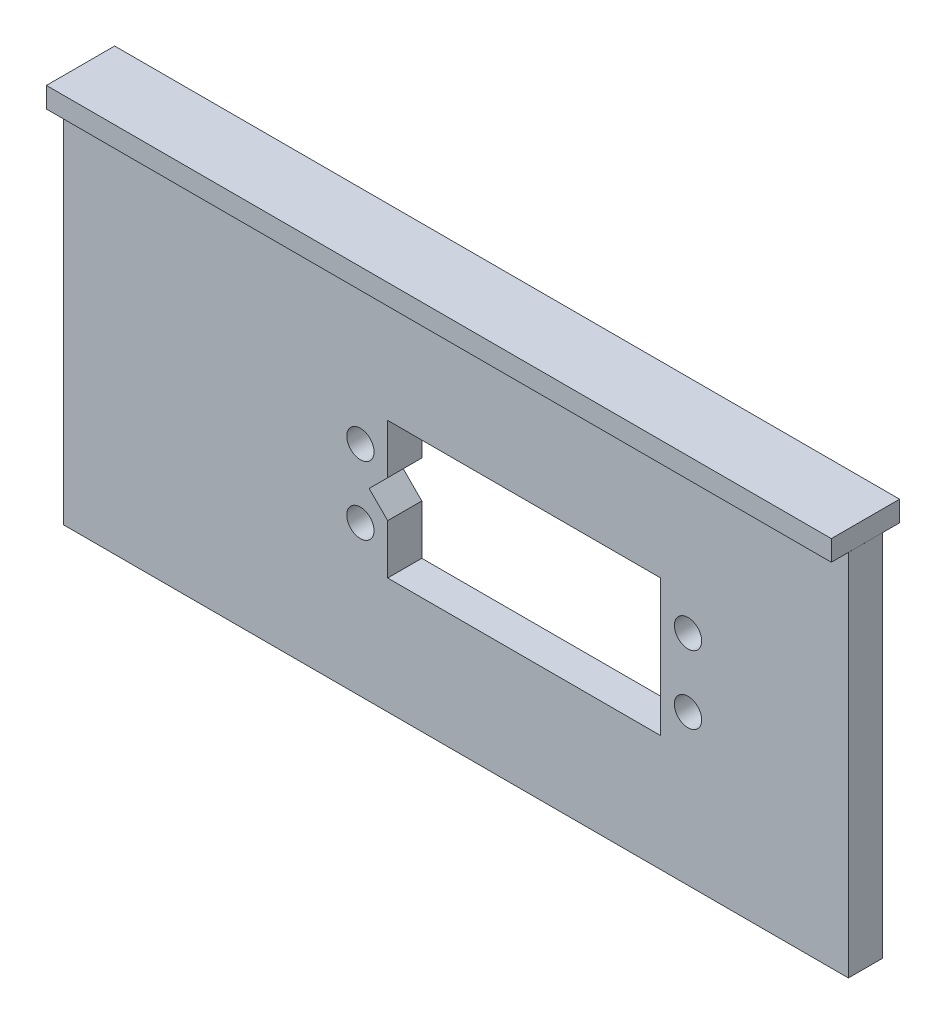
ISO-10303-21;
HEADER;
FILE_DESCRIPTION(('STEP AP214'),'2;1');
FILE_NAME('part.step','',(''),(''),'','','');
FILE_SCHEMA(('AUTOMOTIVE_DESIGN { 1 0 10303 214 1 1 1 1 }'));
ENDSEC;
DATA;
#1=APPLICATION_CONTEXT('core data for automotive mechanical design processes');
#2=APPLICATION_PROTOCOL_DEFINITION('international standard','automotive_design',2000,#1);
#3=PRODUCT_CONTEXT('',#1,'mechanical');
#4=PRODUCT('Part','Part','',(#3));
#5=PRODUCT_RELATED_PRODUCT_CATEGORY('part','',(#4));
#6=PRODUCT_DEFINITION_FORMATION('','',#4);
#7=PRODUCT_DEFINITION_CONTEXT('part definition',#1,'design');
#8=PRODUCT_DEFINITION('design','',#6,#7);
#9=PRODUCT_DEFINITION_SHAPE('','',#8);
#10=(LENGTH_UNIT() NAMED_UNIT(*) SI_UNIT(.MILLI.,.METRE.));
#11=(NAMED_UNIT(*) PLANE_ANGLE_UNIT() SI_UNIT($,.RADIAN.));
#12=(NAMED_UNIT(*) SI_UNIT($,.STERADIAN.) SOLID_ANGLE_UNIT());
#13=UNCERTAINTY_MEASURE_WITH_UNIT(LENGTH_MEASURE(1.E-05),#10,'distance_accuracy_value','');
#14=(GEOMETRIC_REPRESENTATION_CONTEXT(3) GLOBAL_UNCERTAINTY_ASSIGNED_CONTEXT((#13)) GLOBAL_UNIT_ASSIGNED_CONTEXT((#10,
#11,#12)) REPRESENTATION_CONTEXT('',''));
#15=CARTESIAN_POINT('',(0.,0.,0.));
#16=DIRECTION('',(0.,0.,1.));
#17=DIRECTION('',(1.,0.,0.));
#18=AXIS2_PLACEMENT_3D('',#15,#16,#17);
#19=CARTESIAN_POINT('',(3.06248058403234,6.51590056603846,5.));
#20=DIRECTION('',(1.,0.,0.));
#21=DIRECTION('',(0.,0.,-1.));
#22=AXIS2_PLACEMENT_3D('',#19,#20,#21);
#23=PLANE('',#22);
#24=DIRECTION('',(0.,0.,1.));
#25=VECTOR('',#24,1.);
#26=CARTESIAN_POINT('',(3.06248058403234,-0.762325883736207,5.));
#27=LINE('',#26,#25);
#28=CARTESIAN_POINT('',(3.06248058403234,-0.762325883736207,0.));
#29=VERTEX_POINT('',#28);
#30=CARTESIAN_POINT('',(3.06248058403234,-0.762325883736207,5.));
#31=VERTEX_POINT('',#30);
#32=EDGE_CURVE('E121',#29,#31,#27,.T.);
#33=ORIENTED_EDGE('',*,*,#32,.F.);
#34=DIRECTION('',(0.,-1.,0.));
#35=VECTOR('',#34,1.);
#36=CARTESIAN_POINT('',(3.06248058403234,6.51590056603846,0.));
#37=LINE('',#36,#35);
#38=CARTESIAN_POINT('',(3.06248058403234,6.51590056603846,0.));
#39=VERTEX_POINT('',#38);
#40=EDGE_CURVE('E306',#39,#29,#37,.T.);
#41=ORIENTED_EDGE('',*,*,#40,.F.);
#42=DIRECTION('',(0.,0.,-1.));
#43=VECTOR('',#42,1.);
#44=CARTESIAN_POINT('',(3.06248058403234,6.51590056603846,5.));
#45=LINE('',#44,#43);
#46=CARTESIAN_POINT('',(3.06248058403234,6.51590056603846,5.));
#47=VERTEX_POINT('',#46);
#48=EDGE_CURVE('E305',#47,#39,#45,.T.);
#49=ORIENTED_EDGE('',*,*,#48,.F.);
#50=DIRECTION('',(0.,-1.,0.));
#51=VECTOR('',#50,1.);
#52=CARTESIAN_POINT('',(3.06248058403234,6.51590056603846,5.));
#53=LINE('',#52,#51);
#54=EDGE_CURVE('E293',#47,#31,#53,.T.);
#55=ORIENTED_EDGE('',*,*,#54,.T.);
#56=EDGE_LOOP('',(#33,#41,#49,#55));
#57=FACE_BOUND('',#56,.T.);
#58=ADVANCED_FACE('F117',(#57),#23,.T.);
#59=CARTESIAN_POINT('',(0.,0.,5.));
#60=DIRECTION('',(0.,0.,1.));
#61=DIRECTION('',(1.,0.,0.));
#62=AXIS2_PLACEMENT_3D('',#59,#60,#61);
#63=PLANE('',#62);
#64=DIRECTION('',(-0.707106781186539,-0.707106781186556,0.));
#65=VECTOR('',#64,1.);
#66=CARTESIAN_POINT('',(3.06248058403234,-0.762325883736207,5.));
#67=LINE('',#66,#65);
#68=CARTESIAN_POINT('',(0.340707033807064,-3.48409943396155,5.));
#69=VERTEX_POINT('',#68);
#70=EDGE_CURVE('E257',#31,#69,#67,.T.);
#71=ORIENTED_EDGE('',*,*,#70,.F.);
#72=ORIENTED_EDGE('',*,*,#54,.F.);
#73=DIRECTION('',(1.,0.,0.));
#74=VECTOR('',#73,1.);
#75=CARTESIAN_POINT('',(3.06248058403234,6.51590056603846,5.));
#76=LINE('',#75,#74);
#77=CARTESIAN_POINT('',(43.0624805840323,6.51590056603846,5.));
#78=VERTEX_POINT('',#77);
#79=EDGE_CURVE('E302',#47,#78,#76,.T.);
#80=ORIENTED_EDGE('',*,*,#79,.T.);
#81=DIRECTION('',(0.,-1.,0.));
#82=VECTOR('',#81,1.);
#83=CARTESIAN_POINT('',(43.0624805840323,6.51590056603846,5.));
#84=LINE('',#83,#82);
#85=CARTESIAN_POINT('',(43.0624805840323,-13.4840994339615,5.));
#86=VERTEX_POINT('',#85);
#87=EDGE_CURVE('E299',#78,#86,#84,.T.);
#88=ORIENTED_EDGE('',*,*,#87,.T.);
#89=DIRECTION('',(1.,0.,0.));
#90=VECTOR('',#89,1.);
#91=CARTESIAN_POINT('',(3.06248058403234,-13.4840994339615,5.));
#92=LINE('',#91,#90);
#93=CARTESIAN_POINT('',(3.06248058403234,-13.4840994339615,5.));
#94=VERTEX_POINT('',#93);
#95=EDGE_CURVE('E296',#94,#86,#92,.T.);
#96=ORIENTED_EDGE('',*,*,#95,.F.);
#97=CARTESIAN_POINT('',(3.06248058403234,-6.20587298418675,5.));
#98=VERTEX_POINT('',#97);
#99=EDGE_CURVE('E297',#98,#94,#53,.T.);
#100=ORIENTED_EDGE('',*,*,#99,.F.);
#101=DIRECTION('',(0.707106781186556,-0.707106781186539,0.));
#102=VECTOR('',#101,1.);
#103=CARTESIAN_POINT('',(0.340707033807064,-3.48409943396155,5.));
#104=LINE('',#103,#102);
#105=EDGE_CURVE('E141',#69,#98,#104,.T.);
#106=ORIENTED_EDGE('',*,*,#105,.F.);
#107=EDGE_LOOP('',(#71,#72,#80,#88,#96,#100,#106));
#108=FACE_BOUND('',#107,.T.);
#109=CARTESIAN_POINT('',(-0.937519415967665,-8.48409943396155,5.));
#110=DIRECTION('',(0.,0.,1.));
#111=DIRECTION('',(1.,0.,0.));
#112=AXIS2_PLACEMENT_3D('',#109,#110,#111);
#113=CIRCLE('',#112,2.);
#114=CARTESIAN_POINT('',(1.06248058403234,-8.48409943396155,5.));
#115=VERTEX_POINT('',#114);
#116=EDGE_CURVE('E328',#115,#115,#113,.T.);
#117=ORIENTED_EDGE('',*,*,#116,.F.);
#118=EDGE_LOOP('',(#117));
#119=FACE_BOUND('',#118,.T.);
#120=CARTESIAN_POINT('',(-0.937519415967661,1.51590056603845,5.));
#121=DIRECTION('',(0.,0.,1.));
#122=DIRECTION('',(1.,0.,0.));
#123=AXIS2_PLACEMENT_3D('',#120,#121,#122);
#124=CIRCLE('',#123,2.);
#125=CARTESIAN_POINT('',(1.06248058403234,1.51590056603845,5.));
#126=VERTEX_POINT('',#125);
#127=EDGE_CURVE('E340',#126,#126,#124,.T.);
#128=ORIENTED_EDGE('',*,*,#127,.F.);
#129=EDGE_LOOP('',(#128));
#130=FACE_BOUND('',#129,.T.);
#131=DIRECTION('',(0.,-1.,0.));
#132=VECTOR('',#131,1.);
#133=CARTESIAN_POINT('',(-44.4375194159677,23.5159005660385,5.));
#134=LINE('',#133,#132);
#135=CARTESIAN_POINT('',(-44.4375194159677,23.5159005660385,5.));
#136=VERTEX_POINT('',#135);
#137=CARTESIAN_POINT('',(-44.4375194159677,-30.4840994339615,5.));
#138=VERTEX_POINT('',#137);
#139=EDGE_CURVE('E346',#136,#138,#134,.T.);
#140=ORIENTED_EDGE('',*,*,#139,.T.);
#141=DIRECTION('',(1.,0.,0.));
#142=VECTOR('',#141,1.);
#143=CARTESIAN_POINT('',(-44.4375194159677,-30.4840994339615,5.));
#144=LINE('',#143,#142);
#145=CARTESIAN_POINT('',(70.5624805840323,-30.4840994339615,5.));
#146=VERTEX_POINT('',#145);
#147=EDGE_CURVE('E349',#138,#146,#144,.T.);
#148=ORIENTED_EDGE('',*,*,#147,.T.);
#149=DIRECTION('',(0.,-1.,0.));
#150=VECTOR('',#149,1.);
#151=CARTESIAN_POINT('',(70.5624805840323,23.5159005660385,5.));
#152=LINE('',#151,#150);
#153=CARTESIAN_POINT('',(70.5624805840323,23.5159005660385,5.));
#154=VERTEX_POINT('',#153);
#155=EDGE_CURVE('E352',#154,#146,#152,.T.);
#156=ORIENTED_EDGE('',*,*,#155,.F.);
#157=DIRECTION('',(1.,0.,0.));
#158=VECTOR('',#157,1.);
#159=CARTESIAN_POINT('',(-44.4375194159677,23.5159005660385,5.));
#160=LINE('',#159,#158);
#161=CARTESIAN_POINT('',(70.5602786354649,23.5159005660385,5.));
#162=VERTEX_POINT('',#161);
#163=EDGE_CURVE('E355',#162,#154,#160,.T.);
#164=ORIENTED_EDGE('',*,*,#163,.F.);
#165=EDGE_CURVE('E356',#136,#162,#160,.T.);
#166=ORIENTED_EDGE('',*,*,#165,.F.);
#167=EDGE_LOOP('',(#140,#148,#156,#164,#166));
#168=FACE_BOUND('',#167,.T.);
#169=CARTESIAN_POINT('',(47.0624805840323,-8.48409943396155,5.));
#170=DIRECTION('',(0.,0.,1.));
#171=DIRECTION('',(1.,0.,0.));
#172=AXIS2_PLACEMENT_3D('',#169,#170,#171);
#173=CIRCLE('',#172,2.);
#174=CARTESIAN_POINT('',(49.0624805840323,-8.48409943396155,5.));
#175=VERTEX_POINT('',#174);
#176=EDGE_CURVE('E334',#175,#175,#173,.T.);
#177=ORIENTED_EDGE('',*,*,#176,.F.);
#178=EDGE_LOOP('',(#177));
#179=FACE_BOUND('',#178,.T.);
#180=CARTESIAN_POINT('',(47.0624805840323,1.51590056603845,5.));
#181=DIRECTION('',(0.,0.,1.));
#182=DIRECTION('',(1.,0.,0.));
#183=AXIS2_PLACEMENT_3D('',#180,#181,#182);
#184=CIRCLE('',#183,2.);
#185=CARTESIAN_POINT('',(49.0624805840323,1.51590056603845,5.));
#186=VERTEX_POINT('',#185);
#187=EDGE_CURVE('E287',#186,#186,#184,.T.);
#188=ORIENTED_EDGE('',*,*,#187,.F.);
#189=EDGE_LOOP('',(#188));
#190=FACE_BOUND('',#189,.T.);
#191=ADVANCED_FACE('F384',(#108,#119,#130,#168,#179,#190),#63,.T.);
#192=CARTESIAN_POINT('',(0.,0.,0.));
#193=DIRECTION('',(0.,0.,1.));
#194=DIRECTION('',(1.,0.,0.));
#195=AXIS2_PLACEMENT_3D('',#192,#193,#194);
#196=PLANE('',#195);
#197=CARTESIAN_POINT('',(-0.937519415967665,-8.48409943396155,0.));
#198=DIRECTION('',(0.,0.,1.));
#199=DIRECTION('',(1.,0.,0.));
#200=AXIS2_PLACEMENT_3D('',#197,#198,#199);
#201=CIRCLE('',#200,2.);
#202=CARTESIAN_POINT('',(1.06248058403234,-8.48409943396155,0.));
#203=VERTEX_POINT('',#202);
#204=EDGE_CURVE('E327',#203,#203,#201,.T.);
#205=ORIENTED_EDGE('',*,*,#204,.T.);
#206=EDGE_LOOP('',(#205));
#207=FACE_BOUND('',#206,.T.);
#208=CARTESIAN_POINT('',(47.0624805840323,-8.48409943396155,0.));
#209=DIRECTION('',(0.,0.,1.));
#210=DIRECTION('',(1.,0.,0.));
#211=AXIS2_PLACEMENT_3D('',#208,#209,#210);
#212=CIRCLE('',#211,2.);
#213=CARTESIAN_POINT('',(49.0624805840323,-8.48409943396155,0.));
#214=VERTEX_POINT('',#213);
#215=EDGE_CURVE('E331',#214,#214,#212,.T.);
#216=ORIENTED_EDGE('',*,*,#215,.T.);
#217=EDGE_LOOP('',(#216));
#218=FACE_BOUND('',#217,.T.);
#219=CARTESIAN_POINT('',(-0.937519415967661,1.51590056603845,0.));
#220=DIRECTION('',(0.,0.,1.));
#221=DIRECTION('',(1.,0.,0.));
#222=AXIS2_PLACEMENT_3D('',#219,#220,#221);
#223=CIRCLE('',#222,2.);
#224=CARTESIAN_POINT('',(1.06248058403234,1.51590056603845,0.));
#225=VERTEX_POINT('',#224);
#226=EDGE_CURVE('E337',#225,#225,#223,.T.);
#227=ORIENTED_EDGE('',*,*,#226,.T.);
#228=EDGE_LOOP('',(#227));
#229=FACE_BOUND('',#228,.T.);
#230=DIRECTION('',(0.,-1.,0.));
#231=VECTOR('',#230,1.);
#232=CARTESIAN_POINT('',(-44.4375194159677,23.5159005660385,0.));
#233=LINE('',#232,#231);
#234=CARTESIAN_POINT('',(-44.4375194159677,23.5159005660385,0.));
#235=VERTEX_POINT('',#234);
#236=CARTESIAN_POINT('',(-44.4375194159677,-30.4840994339615,0.));
#237=VERTEX_POINT('',#236);
#238=EDGE_CURVE('E343',#235,#237,#233,.T.);
#239=ORIENTED_EDGE('',*,*,#238,.F.);
#240=DIRECTION('',(1.,0.,0.));
#241=VECTOR('',#240,1.);
#242=CARTESIAN_POINT('',(-44.4375194159677,23.5159005660385,0.));
#243=LINE('',#242,#241);
#244=CARTESIAN_POINT('',(70.5602786354649,23.5159005660385,0.));
#245=VERTEX_POINT('',#244);
#246=EDGE_CURVE('E350',#235,#245,#243,.T.);
#247=ORIENTED_EDGE('',*,*,#246,.T.);
#248=CARTESIAN_POINT('',(70.5624805840323,23.5159005660385,0.));
#249=VERTEX_POINT('',#248);
#250=EDGE_CURVE('E367',#245,#249,#243,.T.);
#251=ORIENTED_EDGE('',*,*,#250,.T.);
#252=DIRECTION('',(0.,-1.,0.));
#253=VECTOR('',#252,1.);
#254=CARTESIAN_POINT('',(70.5624805840323,23.5159005660385,0.));
#255=LINE('',#254,#253);
#256=CARTESIAN_POINT('',(70.5624805840323,-30.4840994339615,0.));
#257=VERTEX_POINT('',#256);
#258=EDGE_CURVE('E364',#249,#257,#255,.T.);
#259=ORIENTED_EDGE('',*,*,#258,.T.);
#260=DIRECTION('',(1.,0.,0.));
#261=VECTOR('',#260,1.);
#262=CARTESIAN_POINT('',(-44.4375194159677,-30.4840994339615,0.));
#263=LINE('',#262,#261);
#264=EDGE_CURVE('E361',#237,#257,#263,.T.);
#265=ORIENTED_EDGE('',*,*,#264,.F.);
#266=EDGE_LOOP('',(#239,#247,#251,#259,#265));
#267=FACE_BOUND('',#266,.T.);
#268=ORIENTED_EDGE('',*,*,#40,.T.);
#269=DIRECTION('',(-0.707106781186539,-0.707106781186556,0.));
#270=VECTOR('',#269,1.);
#271=CARTESIAN_POINT('',(1.91240323388431,-1.91240323388426,0.));
#272=LINE('',#271,#270);
#273=CARTESIAN_POINT('',(0.340707033807064,-3.48409943396155,0.));
#274=VERTEX_POINT('',#273);
#275=EDGE_CURVE('E271',#29,#274,#272,.T.);
#276=ORIENTED_EDGE('',*,*,#275,.T.);
#277=DIRECTION('',(0.707106781186556,-0.707106781186539,0.));
#278=VECTOR('',#277,1.);
#279=CARTESIAN_POINT('',(-1.57169620007724,-1.57169620007728,0.));
#280=LINE('',#279,#278);
#281=CARTESIAN_POINT('',(3.06248058403234,-6.20587298418675,0.));
#282=VERTEX_POINT('',#281);
#283=EDGE_CURVE('E268',#274,#282,#280,.T.);
#284=ORIENTED_EDGE('',*,*,#283,.T.);
#285=CARTESIAN_POINT('',(3.06248058403234,-13.4840994339615,0.));
#286=VERTEX_POINT('',#285);
#287=EDGE_CURVE('E290',#282,#286,#37,.T.);
#288=ORIENTED_EDGE('',*,*,#287,.T.);
#289=DIRECTION('',(1.,0.,0.));
#290=VECTOR('',#289,1.);
#291=CARTESIAN_POINT('',(3.06248058403234,-13.4840994339615,0.));
#292=LINE('',#291,#290);
#293=CARTESIAN_POINT('',(43.0624805840323,-13.4840994339615,0.));
#294=VERTEX_POINT('',#293);
#295=EDGE_CURVE('E309',#286,#294,#292,.T.);
#296=ORIENTED_EDGE('',*,*,#295,.T.);
#297=DIRECTION('',(0.,-1.,0.));
#298=VECTOR('',#297,1.);
#299=CARTESIAN_POINT('',(43.0624805840323,6.51590056603846,0.));
#300=LINE('',#299,#298);
#301=CARTESIAN_POINT('',(43.0624805840323,6.51590056603846,0.));
#302=VERTEX_POINT('',#301);
#303=EDGE_CURVE('E312',#302,#294,#300,.T.);
#304=ORIENTED_EDGE('',*,*,#303,.F.);
#305=DIRECTION('',(1.,0.,0.));
#306=VECTOR('',#305,1.);
#307=CARTESIAN_POINT('',(3.06248058403234,6.51590056603846,0.));
#308=LINE('',#307,#306);
#309=EDGE_CURVE('E315',#39,#302,#308,.T.);
#310=ORIENTED_EDGE('',*,*,#309,.F.);
#311=EDGE_LOOP('',(#268,#276,#284,#288,#296,#304,#310));
#312=FACE_BOUND('',#311,.T.);
#313=CARTESIAN_POINT('',(47.0624805840323,1.51590056603845,0.));
#314=DIRECTION('',(0.,0.,1.));
#315=DIRECTION('',(1.,0.,0.));
#316=AXIS2_PLACEMENT_3D('',#313,#314,#315);
#317=CIRCLE('',#316,2.);
#318=CARTESIAN_POINT('',(49.0624805840323,1.51590056603845,0.));
#319=VERTEX_POINT('',#318);
#320=EDGE_CURVE('E278',#319,#319,#317,.T.);
#321=ORIENTED_EDGE('',*,*,#320,.T.);
#322=EDGE_LOOP('',(#321));
#323=FACE_BOUND('',#322,.T.);
#324=ADVANCED_FACE('F405',(#207,#218,#229,#267,#312,#323),#196,.F.);
#325=CARTESIAN_POINT('',(-44.4375194159677,23.5159005660385,5.));
#326=DIRECTION('',(1.,0.,0.));
#327=DIRECTION('',(0.,1.,0.));
#328=AXIS2_PLACEMENT_3D('',#325,#326,#327);
#329=PLANE('',#328);
#330=ORIENTED_EDGE('',*,*,#238,.T.);
#331=DIRECTION('',(0.,0.,-1.));
#332=VECTOR('',#331,1.);
#333=CARTESIAN_POINT('',(-44.4375194159677,-30.4840994339615,5.));
#334=LINE('',#333,#332);
#335=EDGE_CURVE('E373',#138,#237,#334,.T.);
#336=ORIENTED_EDGE('',*,*,#335,.F.);
#337=ORIENTED_EDGE('',*,*,#139,.F.);
#338=DIRECTION('',(0.,0.,1.));
#339=VECTOR('',#338,1.);
#340=CARTESIAN_POINT('',(-44.4375194159677,23.5159005660385,0.));
#341=LINE('',#340,#339);
#342=CARTESIAN_POINT('',(-44.4375194159677,23.5159005660385,7.5));
#343=VERTEX_POINT('',#342);
#344=EDGE_CURVE('E255',#136,#343,#341,.T.);
#345=ORIENTED_EDGE('',*,*,#344,.T.);
#346=DIRECTION('',(0.,-1.,0.));
#347=VECTOR('',#346,1.);
#348=CARTESIAN_POINT('',(-44.4375194159677,26.5159005660385,7.5));
#349=LINE('',#348,#347);
#350=CARTESIAN_POINT('',(-44.4375194159677,26.5159005660385,7.5));
#351=VERTEX_POINT('',#350);
#352=EDGE_CURVE('E236',#351,#343,#349,.T.);
#353=ORIENTED_EDGE('',*,*,#352,.F.);
#354=DIRECTION('',(0.,0.,1.));
#355=VECTOR('',#354,1.);
#356=CARTESIAN_POINT('',(-44.4375194159677,26.5159005660385,7.5));
#357=LINE('',#356,#355);
#358=CARTESIAN_POINT('',(-44.4375194159677,26.5159005660385,-2.5));
#359=VERTEX_POINT('',#358);
#360=EDGE_CURVE('E242',#359,#351,#357,.T.);
#361=ORIENTED_EDGE('',*,*,#360,.F.);
#362=DIRECTION('',(0.,-1.,0.));
#363=VECTOR('',#362,1.);
#364=CARTESIAN_POINT('',(-44.4375194159677,26.5159005660385,-2.5));
#365=LINE('',#364,#363);
#366=CARTESIAN_POINT('',(-44.4375194159677,23.5159005660385,-2.5));
#367=VERTEX_POINT('',#366);
#368=EDGE_CURVE('E495',#359,#367,#365,.T.);
#369=ORIENTED_EDGE('',*,*,#368,.T.);
#370=EDGE_CURVE('E251',#367,#235,#341,.T.);
#371=ORIENTED_EDGE('',*,*,#370,.T.);
#372=EDGE_LOOP('',(#330,#336,#337,#345,#353,#361,#369,#371));
#373=FACE_BOUND('',#372,.T.);
#374=ADVANCED_FACE('F119',(#373),#329,.F.);
#375=CARTESIAN_POINT('',(-44.4375194159677,-30.4840994339615,5.));
#376=DIRECTION('',(0.,1.,0.));
#377=DIRECTION('',(0.,0.,1.));
#378=AXIS2_PLACEMENT_3D('',#375,#376,#377);
#379=PLANE('',#378);
#380=CARTESIAN_POINT('',(-2.93751941596766,-30.4840994339615,2.5));
#381=DIRECTION('',(0.,-1.,0.));
#382=DIRECTION('',(0.,0.,-1.));
#383=AXIS2_PLACEMENT_3D('',#380,#381,#382);
#384=CIRCLE('',#383,1.75);
#385=CARTESIAN_POINT('',(-2.93751941596766,-30.4840994339615,0.749999999999996));
#386=VERTEX_POINT('',#385);
#387=EDGE_CURVE('E279',#386,#386,#384,.T.);
#388=ORIENTED_EDGE('',*,*,#387,.F.);
#389=EDGE_LOOP('',(#388));
#390=FACE_BOUND('',#389,.T.);
#391=CARTESIAN_POINT('',(29.0624805840323,-30.4840994339615,2.5));
#392=DIRECTION('',(0.,-1.,0.));
#393=DIRECTION('',(0.,0.,-1.));
#394=AXIS2_PLACEMENT_3D('',#391,#392,#393);
#395=CIRCLE('',#394,1.75);
#396=CARTESIAN_POINT('',(29.0624805840323,-30.4840994339615,0.749999999999996));
#397=VERTEX_POINT('',#396);
#398=EDGE_CURVE('E282',#397,#397,#395,.T.);
#399=ORIENTED_EDGE('',*,*,#398,.F.);
#400=EDGE_LOOP('',(#399));
#401=FACE_BOUND('',#400,.T.);
#402=ORIENTED_EDGE('',*,*,#264,.T.);
#403=DIRECTION('',(0.,0.,-1.));
#404=VECTOR('',#403,1.);
#405=CARTESIAN_POINT('',(70.5624805840323,-30.4840994339615,5.));
#406=LINE('',#405,#404);
#407=EDGE_CURVE('E371',#146,#257,#406,.T.);
#408=ORIENTED_EDGE('',*,*,#407,.F.);
#409=ORIENTED_EDGE('',*,*,#147,.F.);
#410=ORIENTED_EDGE('',*,*,#335,.T.);
#411=EDGE_LOOP('',(#402,#408,#409,#410));
#412=FACE_BOUND('',#411,.T.);
#413=ADVANCED_FACE('F456',(#390,#401,#412),#379,.F.);
#414=CARTESIAN_POINT('',(70.5624805840323,23.5159005660385,5.));
#415=DIRECTION('',(1.,0.,0.));
#416=DIRECTION('',(0.,0.,-1.));
#417=AXIS2_PLACEMENT_3D('',#414,#415,#416);
#418=PLANE('',#417);
#419=ORIENTED_EDGE('',*,*,#258,.F.);
#420=DIRECTION('',(0.,0.,-1.));
#421=VECTOR('',#420,1.);
#422=CARTESIAN_POINT('',(70.5624805840323,23.5159005660385,5.));
#423=LINE('',#422,#421);
#424=EDGE_CURVE('E359',#154,#249,#423,.T.);
#425=ORIENTED_EDGE('',*,*,#424,.F.);
#426=ORIENTED_EDGE('',*,*,#155,.T.);
#427=ORIENTED_EDGE('',*,*,#407,.T.);
#428=EDGE_LOOP('',(#419,#425,#426,#427));
#429=FACE_BOUND('',#428,.T.);
#430=ADVANCED_FACE('F454',(#429),#418,.T.);
#431=CARTESIAN_POINT('',(-44.4375194159677,23.5159005660385,5.));
#432=DIRECTION('',(0.,1.,0.));
#433=DIRECTION('',(0.,0.,1.));
#434=AXIS2_PLACEMENT_3D('',#431,#432,#433);
#435=PLANE('',#434);
#436=DIRECTION('',(0.,0.,-1.));
#437=VECTOR('',#436,1.);
#438=CARTESIAN_POINT('',(70.5602786354649,23.5159005660385,-2.5));
#439=LINE('',#438,#437);
#440=EDGE_CURVE('E12',#162,#245,#439,.T.);
#441=ORIENTED_EDGE('',*,*,#440,.F.);
#442=ORIENTED_EDGE('',*,*,#163,.T.);
#443=ORIENTED_EDGE('',*,*,#424,.T.);
#444=ORIENTED_EDGE('',*,*,#250,.F.);
#445=EDGE_LOOP('',(#441,#442,#443,#444));
#446=FACE_BOUND('',#445,.T.);
#447=ADVANCED_FACE('F446',(#446),#435,.T.);
#448=CARTESIAN_POINT('',(-0.937519415967661,1.51590056603845,5.));
#449=DIRECTION('',(0.,0.,-1.));
#450=DIRECTION('',(-1.,0.,0.));
#451=AXIS2_PLACEMENT_3D('',#448,#449,#450);
#452=CYLINDRICAL_SURFACE('',#451,2.);
#453=ORIENTED_EDGE('',*,*,#127,.T.);
#454=EDGE_LOOP('',(#453));
#455=FACE_BOUND('',#454,.T.);
#456=ORIENTED_EDGE('',*,*,#226,.F.);
#457=EDGE_LOOP('',(#456));
#458=FACE_BOUND('',#457,.T.);
#459=ADVANCED_FACE('F440',(#455,#458),#452,.F.);
#460=CARTESIAN_POINT('',(47.0624805840323,-8.48409943396155,5.));
#461=DIRECTION('',(0.,0.,-1.));
#462=DIRECTION('',(-1.,0.,0.));
#463=AXIS2_PLACEMENT_3D('',#460,#461,#462);
#464=CYLINDRICAL_SURFACE('',#463,2.);
#465=ORIENTED_EDGE('',*,*,#176,.T.);
#466=EDGE_LOOP('',(#465));
#467=FACE_BOUND('',#466,.T.);
#468=ORIENTED_EDGE('',*,*,#215,.F.);
#469=EDGE_LOOP('',(#468));
#470=FACE_BOUND('',#469,.T.);
#471=ADVANCED_FACE('F435',(#467,#470),#464,.F.);
#472=CARTESIAN_POINT('',(-0.937519415967665,-8.48409943396155,5.));
#473=DIRECTION('',(0.,0.,-1.));
#474=DIRECTION('',(-1.,0.,0.));
#475=AXIS2_PLACEMENT_3D('',#472,#473,#474);
#476=CYLINDRICAL_SURFACE('',#475,2.);
#477=ORIENTED_EDGE('',*,*,#116,.T.);
#478=EDGE_LOOP('',(#477));
#479=FACE_BOUND('',#478,.T.);
#480=ORIENTED_EDGE('',*,*,#204,.F.);
#481=EDGE_LOOP('',(#480));
#482=FACE_BOUND('',#481,.T.);
#483=ADVANCED_FACE('F430',(#479,#482),#476,.F.);
#484=DIRECTION('',(0.,0.,-1.));
#485=VECTOR('',#484,1.);
#486=CARTESIAN_POINT('',(3.06248058403234,-6.20587298418675,5.));
#487=LINE('',#486,#485);
#488=EDGE_CURVE('E375',#98,#282,#487,.T.);
#489=ORIENTED_EDGE('',*,*,#488,.F.);
#490=ORIENTED_EDGE('',*,*,#99,.T.);
#491=DIRECTION('',(0.,0.,-1.));
#492=VECTOR('',#491,1.);
#493=CARTESIAN_POINT('',(3.06248058403234,-13.4840994339615,5.));
#494=LINE('',#493,#492);
#495=EDGE_CURVE('E324',#94,#286,#494,.T.);
#496=ORIENTED_EDGE('',*,*,#495,.T.);
#497=ORIENTED_EDGE('',*,*,#287,.F.);
#498=EDGE_LOOP('',(#489,#490,#496,#497));
#499=FACE_BOUND('',#498,.T.);
#500=ADVANCED_FACE('F403',(#499),#23,.T.);
#501=CARTESIAN_POINT('',(3.06248058403234,-13.4840994339615,5.));
#502=DIRECTION('',(0.,1.,0.));
#503=DIRECTION('',(-1.,0.,0.));
#504=AXIS2_PLACEMENT_3D('',#501,#502,#503);
#505=PLANE('',#504);
#506=ORIENTED_EDGE('',*,*,#295,.F.);
#507=ORIENTED_EDGE('',*,*,#495,.F.);
#508=ORIENTED_EDGE('',*,*,#95,.T.);
#509=DIRECTION('',(0.,0.,-1.));
#510=VECTOR('',#509,1.);
#511=CARTESIAN_POINT('',(43.0624805840323,-13.4840994339615,5.));
#512=LINE('',#511,#510);
#513=EDGE_CURVE('E322',#86,#294,#512,.T.);
#514=ORIENTED_EDGE('',*,*,#513,.T.);
#515=EDGE_LOOP('',(#506,#507,#508,#514));
#516=FACE_BOUND('',#515,.T.);
#517=ADVANCED_FACE('F399',(#516),#505,.T.);
#518=CARTESIAN_POINT('',(43.0624805840323,6.51590056603846,5.));
#519=DIRECTION('',(1.,0.,0.));
#520=DIRECTION('',(0.,0.,-1.));
#521=AXIS2_PLACEMENT_3D('',#518,#519,#520);
#522=PLANE('',#521);
#523=ORIENTED_EDGE('',*,*,#303,.T.);
#524=ORIENTED_EDGE('',*,*,#513,.F.);
#525=ORIENTED_EDGE('',*,*,#87,.F.);
#526=DIRECTION('',(0.,0.,-1.));
#527=VECTOR('',#526,1.);
#528=CARTESIAN_POINT('',(43.0624805840323,6.51590056603846,5.));
#529=LINE('',#528,#527);
#530=EDGE_CURVE('E320',#78,#302,#529,.T.);
#531=ORIENTED_EDGE('',*,*,#530,.T.);
#532=EDGE_LOOP('',(#523,#524,#525,#531));
#533=FACE_BOUND('',#532,.T.);
#534=ADVANCED_FACE('F395',(#533),#522,.F.);
#535=CARTESIAN_POINT('',(3.06248058403234,6.51590056603846,5.));
#536=DIRECTION('',(0.,1.,0.));
#537=DIRECTION('',(0.,0.,1.));
#538=AXIS2_PLACEMENT_3D('',#535,#536,#537);
#539=PLANE('',#538);
#540=ORIENTED_EDGE('',*,*,#309,.T.);
#541=ORIENTED_EDGE('',*,*,#530,.F.);
#542=ORIENTED_EDGE('',*,*,#79,.F.);
#543=ORIENTED_EDGE('',*,*,#48,.T.);
#544=EDGE_LOOP('',(#540,#541,#542,#543));
#545=FACE_BOUND('',#544,.T.);
#546=ADVANCED_FACE('F391',(#545),#539,.F.);
#547=CARTESIAN_POINT('',(47.0624805840323,1.51590056603845,5.));
#548=DIRECTION('',(0.,0.,-1.));
#549=DIRECTION('',(-1.,0.,0.));
#550=AXIS2_PLACEMENT_3D('',#547,#548,#549);
#551=CYLINDRICAL_SURFACE('',#550,2.);
#552=ORIENTED_EDGE('',*,*,#187,.T.);
#553=EDGE_LOOP('',(#552));
#554=FACE_BOUND('',#553,.T.);
#555=ORIENTED_EDGE('',*,*,#320,.F.);
#556=EDGE_LOOP('',(#555));
#557=FACE_BOUND('',#556,.T.);
#558=ADVANCED_FACE('F601',(#554,#557),#551,.F.);
#559=CARTESIAN_POINT('',(29.0624805840323,-15.4840994339615,2.5));
#560=DIRECTION('',(0.,-1.,0.));
#561=DIRECTION('',(0.,0.,-1.));
#562=AXIS2_PLACEMENT_3D('',#559,#560,#561);
#563=CYLINDRICAL_SURFACE('',#562,1.75);
#564=CARTESIAN_POINT('',(29.0624805840323,-15.4840994339615,2.5));
#565=DIRECTION('',(0.,-1.,0.));
#566=DIRECTION('',(0.,0.,-1.));
#567=AXIS2_PLACEMENT_3D('',#564,#565,#566);
#568=CIRCLE('',#567,1.75);
#569=CARTESIAN_POINT('',(29.0624805840323,-15.4840994339615,0.749999999999996));
#570=VERTEX_POINT('',#569);
#571=EDGE_CURVE('E274',#570,#570,#568,.T.);
#572=ORIENTED_EDGE('',*,*,#571,.F.);
#573=EDGE_LOOP('',(#572));
#574=FACE_BOUND('',#573,.T.);
#575=ORIENTED_EDGE('',*,*,#398,.T.);
#576=EDGE_LOOP('',(#575));
#577=FACE_BOUND('',#576,.T.);
#578=ADVANCED_FACE('F609',(#574,#577),#563,.F.);
#579=CARTESIAN_POINT('',(29.0624805840323,-15.4840994339615,2.5));
#580=DIRECTION('',(0.,-1.,0.));
#581=DIRECTION('',(0.,0.,-1.));
#582=AXIS2_PLACEMENT_3D('',#579,#580,#581);
#583=PLANE('',#582);
#584=ORIENTED_EDGE('',*,*,#571,.T.);
#585=EDGE_LOOP('',(#584));
#586=FACE_BOUND('',#585,.T.);
#587=ADVANCED_FACE('F624',(#586),#583,.T.);
#588=CARTESIAN_POINT('',(-2.93751941596766,-15.4840994339615,2.5));
#589=DIRECTION('',(0.,-1.,0.));
#590=DIRECTION('',(0.,0.,-1.));
#591=AXIS2_PLACEMENT_3D('',#588,#589,#590);
#592=CYLINDRICAL_SURFACE('',#591,1.75);
#593=CARTESIAN_POINT('',(-2.93751941596766,-15.4840994339615,2.5));
#594=DIRECTION('',(0.,-1.,0.));
#595=DIRECTION('',(0.,0.,-1.));
#596=AXIS2_PLACEMENT_3D('',#593,#594,#595);
#597=CIRCLE('',#596,1.75);
#598=CARTESIAN_POINT('',(-2.93751941596766,-15.4840994339615,0.749999999999996));
#599=VERTEX_POINT('',#598);
#600=EDGE_CURVE('E275',#599,#599,#597,.T.);
#601=ORIENTED_EDGE('',*,*,#600,.F.);
#602=EDGE_LOOP('',(#601));
#603=FACE_BOUND('',#602,.T.);
#604=ORIENTED_EDGE('',*,*,#387,.T.);
#605=EDGE_LOOP('',(#604));
#606=FACE_BOUND('',#605,.T.);
#607=ADVANCED_FACE('F634',(#603,#606),#592,.F.);
#608=CARTESIAN_POINT('',(-2.93751941596766,-15.4840994339615,2.5));
#609=DIRECTION('',(0.,-1.,0.));
#610=DIRECTION('',(0.,0.,-1.));
#611=AXIS2_PLACEMENT_3D('',#608,#609,#610);
#612=PLANE('',#611);
#613=ORIENTED_EDGE('',*,*,#600,.T.);
#614=EDGE_LOOP('',(#613));
#615=FACE_BOUND('',#614,.T.);
#616=ADVANCED_FACE('F418',(#615),#612,.T.);
#617=CARTESIAN_POINT('',(3.06248058403234,-0.762325883736207,-5.));
#618=DIRECTION('',(-0.707106781186556,0.707106781186539,0.));
#619=DIRECTION('',(-0.707106781186539,-0.707106781186556,0.));
#620=AXIS2_PLACEMENT_3D('',#617,#618,#619);
#621=PLANE('',#620);
#622=ORIENTED_EDGE('',*,*,#32,.T.);
#623=ORIENTED_EDGE('',*,*,#70,.T.);
#624=DIRECTION('',(0.,0.,1.));
#625=VECTOR('',#624,1.);
#626=CARTESIAN_POINT('',(0.340707033807064,-3.48409943396155,-5.));
#627=LINE('',#626,#625);
#628=EDGE_CURVE('E266',#274,#69,#627,.T.);
#629=ORIENTED_EDGE('',*,*,#628,.F.);
#630=ORIENTED_EDGE('',*,*,#275,.F.);
#631=EDGE_LOOP('',(#622,#623,#629,#630));
#632=FACE_BOUND('',#631,.T.);
#633=ADVANCED_FACE('F379',(#632),#621,.F.);
#634=CARTESIAN_POINT('',(0.340707033807064,-3.48409943396155,-5.));
#635=DIRECTION('',(-0.707106781186539,-0.707106781186556,0.));
#636=DIRECTION('',(0.707106781186556,-0.707106781186539,0.));
#637=AXIS2_PLACEMENT_3D('',#634,#635,#636);
#638=PLANE('',#637);
#639=ORIENTED_EDGE('',*,*,#628,.T.);
#640=ORIENTED_EDGE('',*,*,#105,.T.);
#641=ORIENTED_EDGE('',*,*,#488,.T.);
#642=ORIENTED_EDGE('',*,*,#283,.F.);
#643=EDGE_LOOP('',(#639,#640,#641,#642));
#644=FACE_BOUND('',#643,.T.);
#645=ADVANCED_FACE('F407',(#644),#638,.F.);
#646=CARTESIAN_POINT('',(0.,23.5159005660385,0.));
#647=DIRECTION('',(0.,-1.,0.));
#648=DIRECTION('',(0.,0.,-1.));
#649=AXIS2_PLACEMENT_3D('',#646,#647,#648);
#650=PLANE('',#649);
#651=ORIENTED_EDGE('',*,*,#246,.F.);
#652=ORIENTED_EDGE('',*,*,#370,.F.);
#653=DIRECTION('',(-1.,0.,0.));
#654=VECTOR('',#653,1.);
#655=CARTESIAN_POINT('',(-44.4375194159677,23.5159005660385,-2.5));
#656=LINE('',#655,#654);
#657=CARTESIAN_POINT('',(70.5602786354649,23.5159005660385,-2.5));
#658=VERTEX_POINT('',#657);
#659=EDGE_CURVE('E481',#658,#367,#656,.T.);
#660=ORIENTED_EDGE('',*,*,#659,.F.);
#661=EDGE_CURVE('E128',#245,#658,#439,.T.);
#662=ORIENTED_EDGE('',*,*,#661,.F.);
#663=EDGE_LOOP('',(#651,#652,#660,#662));
#664=FACE_BOUND('',#663,.T.);
#665=ADVANCED_FACE('F409',(#664),#650,.T.);
#666=CARTESIAN_POINT('',(70.5602786354649,26.5159005660385,7.49999999999999));
#667=DIRECTION('',(0.,0.,-1.));
#668=DIRECTION('',(-1.,0.,0.));
#669=AXIS2_PLACEMENT_3D('',#666,#667,#668);
#670=PLANE('',#669);
#671=DIRECTION('',(1.,0.,0.));
#672=VECTOR('',#671,1.);
#673=CARTESIAN_POINT('',(70.5602786354649,23.5159005660385,7.49999999999999));
#674=LINE('',#673,#672);
#675=CARTESIAN_POINT('',(70.5602786354649,23.5159005660385,7.49999999999999));
#676=VERTEX_POINT('',#675);
#677=EDGE_CURVE('E485',#343,#676,#674,.T.);
#678=ORIENTED_EDGE('',*,*,#677,.T.);
#679=DIRECTION('',(0.,-1.,0.));
#680=VECTOR('',#679,1.);
#681=CARTESIAN_POINT('',(70.5602786354649,26.5159005660385,7.49999999999999));
#682=LINE('',#681,#680);
#683=CARTESIAN_POINT('',(70.5602786354649,26.5159005660385,7.49999999999999));
#684=VERTEX_POINT('',#683);
#685=EDGE_CURVE('E238',#684,#676,#682,.T.);
#686=ORIENTED_EDGE('',*,*,#685,.F.);
#687=DIRECTION('',(1.,0.,0.));
#688=VECTOR('',#687,1.);
#689=CARTESIAN_POINT('',(70.5602786354649,26.5159005660385,7.49999999999999));
#690=LINE('',#689,#688);
#691=EDGE_CURVE('E232',#351,#684,#690,.T.);
#692=ORIENTED_EDGE('',*,*,#691,.F.);
#693=ORIENTED_EDGE('',*,*,#352,.T.);
#694=EDGE_LOOP('',(#678,#686,#692,#693));
#695=FACE_BOUND('',#694,.T.);
#696=ADVANCED_FACE('F234',(#695),#670,.F.);
#697=CARTESIAN_POINT('',(70.5602786354649,26.5159005660385,-2.5));
#698=DIRECTION('',(-1.,0.,0.));
#699=DIRECTION('',(0.,0.,1.));
#700=AXIS2_PLACEMENT_3D('',#697,#698,#699);
#701=PLANE('',#700);
#702=EDGE_CURVE('E127',#676,#162,#439,.T.);
#703=ORIENTED_EDGE('',*,*,#702,.T.);
#704=ORIENTED_EDGE('',*,*,#440,.T.);
#705=ORIENTED_EDGE('',*,*,#661,.T.);
#706=DIRECTION('',(0.,-1.,0.));
#707=VECTOR('',#706,1.);
#708=CARTESIAN_POINT('',(70.5602786354649,26.5159005660385,-2.5));
#709=LINE('',#708,#707);
#710=CARTESIAN_POINT('',(70.5602786354649,26.5159005660385,-2.5));
#711=VERTEX_POINT('',#710);
#712=EDGE_CURVE('E261',#711,#658,#709,.T.);
#713=ORIENTED_EDGE('',*,*,#712,.F.);
#714=DIRECTION('',(0.,0.,-1.));
#715=VECTOR('',#714,1.);
#716=CARTESIAN_POINT('',(70.5602786354649,26.5159005660385,-2.5));
#717=LINE('',#716,#715);
#718=EDGE_CURVE('E241',#684,#711,#717,.T.);
#719=ORIENTED_EDGE('',*,*,#718,.F.);
#720=ORIENTED_EDGE('',*,*,#685,.T.);
#721=EDGE_LOOP('',(#703,#704,#705,#713,#719,#720));
#722=FACE_BOUND('',#721,.T.);
#723=ADVANCED_FACE('F487',(#722),#701,.F.);
#724=CARTESIAN_POINT('',(-44.4375194159677,26.5159005660385,-2.5));
#725=DIRECTION('',(0.,0.,1.));
#726=DIRECTION('',(1.,0.,0.));
#727=AXIS2_PLACEMENT_3D('',#724,#725,#726);
#728=PLANE('',#727);
#729=ORIENTED_EDGE('',*,*,#659,.T.);
#730=ORIENTED_EDGE('',*,*,#368,.F.);
#731=DIRECTION('',(-1.,0.,0.));
#732=VECTOR('',#731,1.);
#733=CARTESIAN_POINT('',(-44.4375194159677,26.5159005660385,-2.5));
#734=LINE('',#733,#732);
#735=EDGE_CURVE('E247',#711,#359,#734,.T.);
#736=ORIENTED_EDGE('',*,*,#735,.F.);
#737=ORIENTED_EDGE('',*,*,#712,.T.);
#738=EDGE_LOOP('',(#729,#730,#736,#737));
#739=FACE_BOUND('',#738,.T.);
#740=ADVANCED_FACE('F497',(#739),#728,.F.);
#741=CARTESIAN_POINT('',(0.,26.5159005660385,0.));
#742=DIRECTION('',(0.,-1.,0.));
#743=DIRECTION('',(0.,0.,-1.));
#744=AXIS2_PLACEMENT_3D('',#741,#742,#743);
#745=PLANE('',#744);
#746=ORIENTED_EDGE('',*,*,#360,.T.);
#747=ORIENTED_EDGE('',*,*,#691,.T.);
#748=ORIENTED_EDGE('',*,*,#718,.T.);
#749=ORIENTED_EDGE('',*,*,#735,.T.);
#750=EDGE_LOOP('',(#746,#747,#748,#749));
#751=FACE_BOUND('',#750,.T.);
#752=ADVANCED_FACE('F245',(#751),#745,.F.);
#753=ORIENTED_EDGE('',*,*,#344,.F.);
#754=ORIENTED_EDGE('',*,*,#165,.T.);
#755=ORIENTED_EDGE('',*,*,#702,.F.);
#756=ORIENTED_EDGE('',*,*,#677,.F.);
#757=EDGE_LOOP('',(#753,#754,#755,#756));
#758=FACE_BOUND('',#757,.T.);
#759=ADVANCED_FACE('F417',(#758),#650,.T.);
#760=CLOSED_SHELL('',(#58,#191,#324,#374,#413,#430,#447,#459,#471,#483,#500,#517,#534,#546,#558,
#578,#587,#607,#616,#633,#645,#665,#696,#723,#740,#752,#759));
#761=MANIFOLD_SOLID_BREP('B2',#760);
#762=ADVANCED_BREP_SHAPE_REPRESENTATION('',(#18,#761),#14);
#763=SHAPE_DEFINITION_REPRESENTATION(#9,#762);
ENDSEC;
END-ISO-10303-21;
